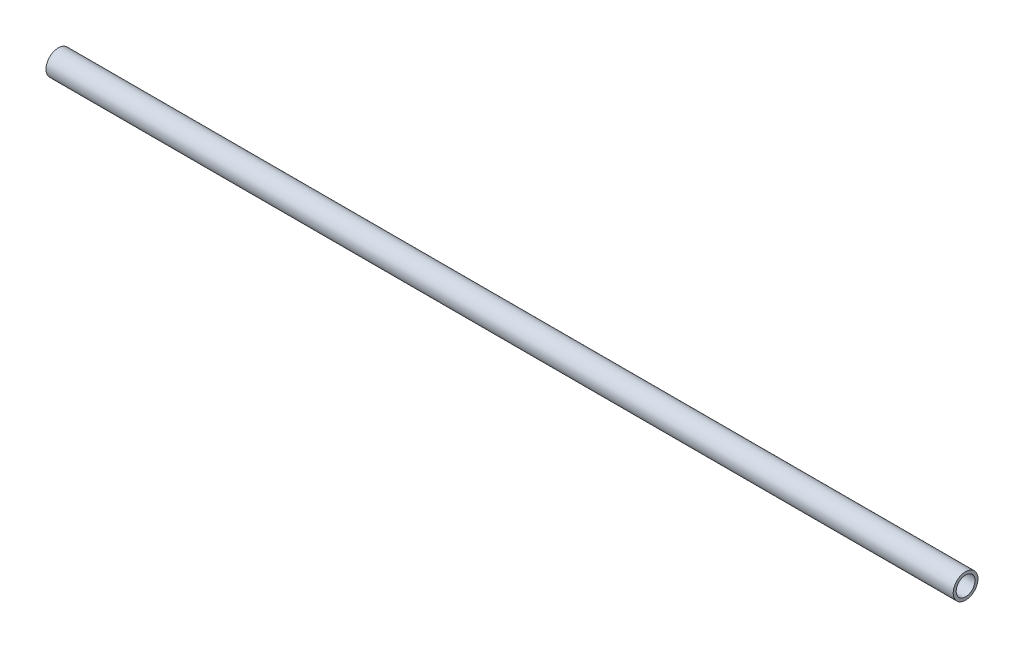
ISO-10303-21;
HEADER;
FILE_DESCRIPTION(('STEP AP214'),'2;1');
FILE_NAME('part.step','',(''),(''),'','','');
FILE_SCHEMA(('AUTOMOTIVE_DESIGN { 1 0 10303 214 1 1 1 1 }'));
ENDSEC;
DATA;
#1=APPLICATION_CONTEXT('core data for automotive mechanical design processes');
#2=APPLICATION_PROTOCOL_DEFINITION('international standard','automotive_design',2000,#1);
#3=PRODUCT_CONTEXT('',#1,'mechanical');
#4=PRODUCT('Part','Part','',(#3));
#5=PRODUCT_RELATED_PRODUCT_CATEGORY('part','',(#4));
#6=PRODUCT_DEFINITION_FORMATION('','',#4);
#7=PRODUCT_DEFINITION_CONTEXT('part definition',#1,'design');
#8=PRODUCT_DEFINITION('design','',#6,#7);
#9=PRODUCT_DEFINITION_SHAPE('','',#8);
#10=(LENGTH_UNIT() NAMED_UNIT(*) SI_UNIT(.MILLI.,.METRE.));
#11=(NAMED_UNIT(*) PLANE_ANGLE_UNIT() SI_UNIT($,.RADIAN.));
#12=(NAMED_UNIT(*) SI_UNIT($,.STERADIAN.) SOLID_ANGLE_UNIT());
#13=UNCERTAINTY_MEASURE_WITH_UNIT(LENGTH_MEASURE(1.E-05),#10,'distance_accuracy_value','');
#14=(GEOMETRIC_REPRESENTATION_CONTEXT(3) GLOBAL_UNCERTAINTY_ASSIGNED_CONTEXT((#13)) GLOBAL_UNIT_ASSIGNED_CONTEXT((#10,
#11,#12)) REPRESENTATION_CONTEXT('',''));
#15=CARTESIAN_POINT('',(0.,0.,0.));
#16=DIRECTION('',(0.,0.,1.));
#17=DIRECTION('',(1.,0.,0.));
#18=AXIS2_PLACEMENT_3D('',#15,#16,#17);
#19=CARTESIAN_POINT('',(930.,0.,0.));
#20=DIRECTION('',(1.,0.,0.));
#21=DIRECTION('',(0.,0.,-1.));
#22=AXIS2_PLACEMENT_3D('',#19,#20,#21);
#23=PLANE('',#22);
#24=CARTESIAN_POINT('',(930.,0.,0.));
#25=DIRECTION('',(1.,0.,0.));
#26=DIRECTION('',(0.,0.,-1.));
#27=AXIS2_PLACEMENT_3D('',#24,#25,#26);
#28=CIRCLE('',#27,12.7);
#29=CARTESIAN_POINT('',(930.,0.,-12.7));
#30=VERTEX_POINT('',#29);
#31=EDGE_CURVE('E10',#30,#30,#28,.T.);
#32=ORIENTED_EDGE('',*,*,#31,.T.);
#33=EDGE_LOOP('',(#32));
#34=FACE_BOUND('',#33,.T.);
#35=CARTESIAN_POINT('',(930.,0.,0.));
#36=DIRECTION('',(1.,0.,0.));
#37=DIRECTION('',(0.,0.,-1.));
#38=AXIS2_PLACEMENT_3D('',#35,#36,#37);
#39=CIRCLE('',#38,9.652);
#40=CARTESIAN_POINT('',(930.,0.,-9.652));
#41=VERTEX_POINT('',#40);
#42=EDGE_CURVE('E45',#41,#41,#39,.T.);
#43=ORIENTED_EDGE('',*,*,#42,.F.);
#44=EDGE_LOOP('',(#43));
#45=FACE_BOUND('',#44,.T.);
#46=ADVANCED_FACE('F34',(#34,#45),#23,.T.);
#47=CARTESIAN_POINT('',(0.,0.,0.));
#48=DIRECTION('',(1.,0.,0.));
#49=DIRECTION('',(0.,0.,-1.));
#50=AXIS2_PLACEMENT_3D('',#47,#48,#49);
#51=PLANE('',#50);
#52=CARTESIAN_POINT('',(0.,0.,0.));
#53=DIRECTION('',(1.,0.,0.));
#54=DIRECTION('',(0.,0.,-1.));
#55=AXIS2_PLACEMENT_3D('',#52,#53,#54);
#56=CIRCLE('',#55,12.7);
#57=CARTESIAN_POINT('',(0.,0.,-12.7));
#58=VERTEX_POINT('',#57);
#59=EDGE_CURVE('E38',#58,#58,#56,.T.);
#60=ORIENTED_EDGE('',*,*,#59,.F.);
#61=EDGE_LOOP('',(#60));
#62=FACE_BOUND('',#61,.T.);
#63=CARTESIAN_POINT('',(0.,0.,0.));
#64=DIRECTION('',(1.,0.,0.));
#65=DIRECTION('',(0.,0.,-1.));
#66=AXIS2_PLACEMENT_3D('',#63,#64,#65);
#67=CIRCLE('',#66,9.652);
#68=CARTESIAN_POINT('',(0.,0.,-9.652));
#69=VERTEX_POINT('',#68);
#70=EDGE_CURVE('E47',#69,#69,#67,.T.);
#71=ORIENTED_EDGE('',*,*,#70,.T.);
#72=EDGE_LOOP('',(#71));
#73=FACE_BOUND('',#72,.T.);
#74=ADVANCED_FACE('F57',(#62,#73),#51,.F.);
#75=CARTESIAN_POINT('',(930.,0.,0.));
#76=DIRECTION('',(-1.,0.,0.));
#77=DIRECTION('',(0.,0.,1.));
#78=AXIS2_PLACEMENT_3D('',#75,#76,#77);
#79=CYLINDRICAL_SURFACE('',#78,12.7);
#80=ORIENTED_EDGE('',*,*,#31,.F.);
#81=EDGE_LOOP('',(#80));
#82=FACE_BOUND('',#81,.T.);
#83=ORIENTED_EDGE('',*,*,#59,.T.);
#84=EDGE_LOOP('',(#83));
#85=FACE_BOUND('',#84,.T.);
#86=ADVANCED_FACE('F36',(#82,#85),#79,.T.);
#87=CARTESIAN_POINT('',(930.,0.,0.));
#88=DIRECTION('',(-1.,0.,0.));
#89=DIRECTION('',(0.,0.,1.));
#90=AXIS2_PLACEMENT_3D('',#87,#88,#89);
#91=CYLINDRICAL_SURFACE('',#90,9.652);
#92=ORIENTED_EDGE('',*,*,#42,.T.);
#93=EDGE_LOOP('',(#92));
#94=FACE_BOUND('',#93,.T.);
#95=ORIENTED_EDGE('',*,*,#70,.F.);
#96=EDGE_LOOP('',(#95));
#97=FACE_BOUND('',#96,.T.);
#98=ADVANCED_FACE('F53',(#94,#97),#91,.F.);
#99=CLOSED_SHELL('',(#46,#74,#86,#98));
#100=MANIFOLD_SOLID_BREP('B2',#99);
#101=ADVANCED_BREP_SHAPE_REPRESENTATION('',(#18,#100),#14);
#102=SHAPE_DEFINITION_REPRESENTATION(#9,#101);
ENDSEC;
END-ISO-10303-21;
